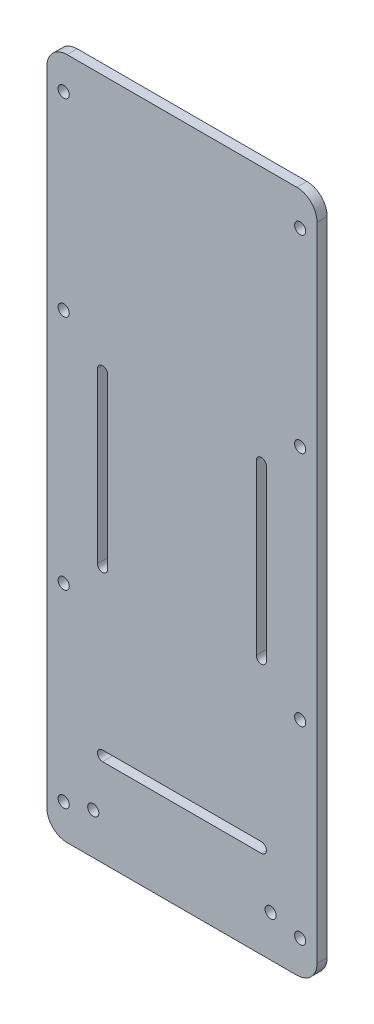
ISO-10303-21;
HEADER;
FILE_DESCRIPTION(('STEP AP214'),'2;1');
FILE_NAME('part.step','',(''),(''),'','','');
FILE_SCHEMA(('AUTOMOTIVE_DESIGN { 1 0 10303 214 1 1 1 1 }'));
ENDSEC;
DATA;
#1=APPLICATION_CONTEXT('core data for automotive mechanical design processes');
#2=APPLICATION_PROTOCOL_DEFINITION('international standard','automotive_design',2000,#1);
#3=PRODUCT_CONTEXT('',#1,'mechanical');
#4=PRODUCT('Part','Part','',(#3));
#5=PRODUCT_RELATED_PRODUCT_CATEGORY('part','',(#4));
#6=PRODUCT_DEFINITION_FORMATION('','',#4);
#7=PRODUCT_DEFINITION_CONTEXT('part definition',#1,'design');
#8=PRODUCT_DEFINITION('design','',#6,#7);
#9=PRODUCT_DEFINITION_SHAPE('','',#8);
#10=(LENGTH_UNIT() NAMED_UNIT(*) SI_UNIT(.MILLI.,.METRE.));
#11=(NAMED_UNIT(*) PLANE_ANGLE_UNIT() SI_UNIT($,.RADIAN.));
#12=(NAMED_UNIT(*) SI_UNIT($,.STERADIAN.) SOLID_ANGLE_UNIT());
#13=UNCERTAINTY_MEASURE_WITH_UNIT(LENGTH_MEASURE(1.E-05),#10,'distance_accuracy_value','');
#14=(GEOMETRIC_REPRESENTATION_CONTEXT(3) GLOBAL_UNCERTAINTY_ASSIGNED_CONTEXT((#13)) GLOBAL_UNIT_ASSIGNED_CONTEXT((#10,
#11,#12)) REPRESENTATION_CONTEXT('',''));
#15=CARTESIAN_POINT('',(0.,0.,0.));
#16=DIRECTION('',(0.,0.,1.));
#17=DIRECTION('',(1.,0.,0.));
#18=AXIS2_PLACEMENT_3D('',#15,#16,#17);
#19=CARTESIAN_POINT('',(-34.,-95.,3.));
#20=DIRECTION('',(0.,0.,1.));
#21=DIRECTION('',(1.,0.,0.));
#22=AXIS2_PLACEMENT_3D('',#19,#20,#21);
#23=PLANE('',#22);
#24=CARTESIAN_POINT('',(26.25,-88.75,3.));
#25=DIRECTION('',(0.,0.,1.));
#26=DIRECTION('',(1.,0.,0.));
#27=AXIS2_PLACEMENT_3D('',#24,#25,#26);
#28=CIRCLE('',#27,1.65);
#29=CARTESIAN_POINT('',(27.9,-88.75,3.));
#30=VERTEX_POINT('',#29);
#31=EDGE_CURVE('E223',#30,#30,#28,.T.);
#32=ORIENTED_EDGE('',*,*,#31,.F.);
#33=EDGE_LOOP('',(#32));
#34=FACE_BOUND('',#33,.T.);
#35=CARTESIAN_POINT('',(23.4999999999998,25.,3.));
#36=DIRECTION('',(0.,0.,1.));
#37=DIRECTION('',(-1.,0.,0.));
#38=AXIS2_PLACEMENT_3D('',#35,#36,#37);
#39=CIRCLE('',#38,1.5);
#40=CARTESIAN_POINT('',(24.9999999999998,25.,3.));
#41=VERTEX_POINT('',#40);
#42=CARTESIAN_POINT('',(21.9999999999998,25.,3.));
#43=VERTEX_POINT('',#42);
#44=EDGE_CURVE('E52',#41,#43,#39,.T.);
#45=ORIENTED_EDGE('',*,*,#44,.F.);
#46=DIRECTION('',(0.,1.,0.));
#47=VECTOR('',#46,1.);
#48=CARTESIAN_POINT('',(24.9999999999998,25.,3.));
#49=LINE('',#48,#47);
#50=CARTESIAN_POINT('',(25.0000000000002,-24.9999999999998,3.));
#51=VERTEX_POINT('',#50);
#52=EDGE_CURVE('E231',#51,#41,#49,.T.);
#53=ORIENTED_EDGE('',*,*,#52,.F.);
#54=CARTESIAN_POINT('',(23.5000000000002,-24.9999999999998,3.));
#55=DIRECTION('',(0.,0.,1.));
#56=DIRECTION('',(-1.,0.,0.));
#57=AXIS2_PLACEMENT_3D('',#54,#55,#56);
#58=CIRCLE('',#57,1.5);
#59=CARTESIAN_POINT('',(22.0000000000002,-24.9999999999998,3.));
#60=VERTEX_POINT('',#59);
#61=EDGE_CURVE('E245',#60,#51,#58,.T.);
#62=ORIENTED_EDGE('',*,*,#61,.F.);
#63=DIRECTION('',(0.,-1.,0.));
#64=VECTOR('',#63,1.);
#65=CARTESIAN_POINT('',(21.9999999999998,25.,3.));
#66=LINE('',#65,#64);
#67=EDGE_CURVE('E242',#43,#60,#66,.T.);
#68=ORIENTED_EDGE('',*,*,#67,.F.);
#69=EDGE_LOOP('',(#45,#53,#62,#68));
#70=FACE_BOUND('',#69,.T.);
#71=CARTESIAN_POINT('',(-23.4999999999998,-73.5,3.));
#72=DIRECTION('',(0.,0.,1.));
#73=DIRECTION('',(-1.,0.,0.));
#74=AXIS2_PLACEMENT_3D('',#71,#72,#73);
#75=CIRCLE('',#74,1.50000000000002);
#76=CARTESIAN_POINT('',(-23.4999999999998,-72.,3.));
#77=VERTEX_POINT('',#76);
#78=CARTESIAN_POINT('',(-23.4999999999998,-75.0000000000001,3.));
#79=VERTEX_POINT('',#78);
#80=EDGE_CURVE('E60',#77,#79,#75,.T.);
#81=ORIENTED_EDGE('',*,*,#80,.F.);
#82=DIRECTION('',(-1.,0.,0.));
#83=VECTOR('',#82,1.);
#84=CARTESIAN_POINT('',(-23.4999999999998,-72.,3.));
#85=LINE('',#84,#83);
#86=CARTESIAN_POINT('',(23.4999999999998,-72.,3.));
#87=VERTEX_POINT('',#86);
#88=EDGE_CURVE('E195',#87,#77,#85,.T.);
#89=ORIENTED_EDGE('',*,*,#88,.F.);
#90=CARTESIAN_POINT('',(23.4999999999998,-73.5,3.));
#91=DIRECTION('',(0.,0.,1.));
#92=DIRECTION('',(-1.,0.,0.));
#93=AXIS2_PLACEMENT_3D('',#90,#91,#92);
#94=CIRCLE('',#93,1.50000000000002);
#95=CARTESIAN_POINT('',(23.4999999999998,-75.0000000000001,3.));
#96=VERTEX_POINT('',#95);
#97=EDGE_CURVE('E198',#96,#87,#94,.T.);
#98=ORIENTED_EDGE('',*,*,#97,.F.);
#99=DIRECTION('',(1.,0.,0.));
#100=VECTOR('',#99,1.);
#101=CARTESIAN_POINT('',(-23.4999999999998,-75.0000000000001,3.));
#102=LINE('',#101,#100);
#103=EDGE_CURVE('E204',#79,#96,#102,.T.);
#104=ORIENTED_EDGE('',*,*,#103,.F.);
#105=EDGE_LOOP('',(#81,#89,#98,#104));
#106=FACE_BOUND('',#105,.T.);
#107=CARTESIAN_POINT('',(-26.25,-88.75,3.));
#108=DIRECTION('',(0.,0.,1.));
#109=DIRECTION('',(1.,0.,0.));
#110=AXIS2_PLACEMENT_3D('',#107,#108,#109);
#111=CIRCLE('',#110,1.65);
#112=CARTESIAN_POINT('',(-24.6,-88.75,3.));
#113=VERTEX_POINT('',#112);
#114=EDGE_CURVE('E216',#113,#113,#111,.T.);
#115=ORIENTED_EDGE('',*,*,#114,.F.);
#116=EDGE_LOOP('',(#115));
#117=FACE_BOUND('',#116,.T.);
#118=CARTESIAN_POINT('',(-23.5,25.,3.));
#119=DIRECTION('',(0.,0.,1.));
#120=DIRECTION('',(1.,0.,0.));
#121=AXIS2_PLACEMENT_3D('',#118,#119,#120);
#122=CIRCLE('',#121,1.5);
#123=CARTESIAN_POINT('',(-22.,25.,3.));
#124=VERTEX_POINT('',#123);
#125=CARTESIAN_POINT('',(-25.,25.,3.));
#126=VERTEX_POINT('',#125);
#127=EDGE_CURVE('E222',#124,#126,#122,.T.);
#128=ORIENTED_EDGE('',*,*,#127,.F.);
#129=DIRECTION('',(0.,1.,0.));
#130=VECTOR('',#129,1.);
#131=CARTESIAN_POINT('',(-22.,25.,3.));
#132=LINE('',#131,#130);
#133=CARTESIAN_POINT('',(-22.,-25.,3.));
#134=VERTEX_POINT('',#133);
#135=EDGE_CURVE('E260',#134,#124,#132,.T.);
#136=ORIENTED_EDGE('',*,*,#135,.F.);
#137=CARTESIAN_POINT('',(-23.5,-25.,3.));
#138=DIRECTION('',(0.,0.,1.));
#139=DIRECTION('',(1.,0.,0.));
#140=AXIS2_PLACEMENT_3D('',#137,#138,#139);
#141=CIRCLE('',#140,1.5);
#142=CARTESIAN_POINT('',(-25.,-25.,3.));
#143=VERTEX_POINT('',#142);
#144=EDGE_CURVE('E274',#143,#134,#141,.T.);
#145=ORIENTED_EDGE('',*,*,#144,.F.);
#146=DIRECTION('',(0.,-1.,0.));
#147=VECTOR('',#146,1.);
#148=CARTESIAN_POINT('',(-25.,25.,3.));
#149=LINE('',#148,#147);
#150=EDGE_CURVE('E271',#126,#143,#149,.T.);
#151=ORIENTED_EDGE('',*,*,#150,.F.);
#152=EDGE_LOOP('',(#128,#136,#145,#151));
#153=FACE_BOUND('',#152,.T.);
#154=CARTESIAN_POINT('',(-35.,-35.,3.));
#155=DIRECTION('',(0.,0.,1.));
#156=DIRECTION('',(-1.,0.,0.));
#157=AXIS2_PLACEMENT_3D('',#154,#155,#156);
#158=CIRCLE('',#157,1.65);
#159=CARTESIAN_POINT('',(-36.65,-35.,3.));
#160=VERTEX_POINT('',#159);
#161=EDGE_CURVE('E294',#160,#160,#158,.T.);
#162=ORIENTED_EDGE('',*,*,#161,.F.);
#163=EDGE_LOOP('',(#162));
#164=FACE_BOUND('',#163,.T.);
#165=CARTESIAN_POINT('',(34.9999999999994,-91.0000000000002,3.));
#166=DIRECTION('',(0.,0.,1.));
#167=DIRECTION('',(1.,0.,0.));
#168=AXIS2_PLACEMENT_3D('',#165,#166,#167);
#169=CIRCLE('',#168,1.65);
#170=CARTESIAN_POINT('',(36.6499999999994,-91.0000000000002,3.));
#171=VERTEX_POINT('',#170);
#172=EDGE_CURVE('E306',#171,#171,#169,.T.);
#173=ORIENTED_EDGE('',*,*,#172,.F.);
#174=EDGE_LOOP('',(#173));
#175=FACE_BOUND('',#174,.T.);
#176=CARTESIAN_POINT('',(34.9999999999998,35.0000000000002,3.));
#177=DIRECTION('',(0.,0.,1.));
#178=DIRECTION('',(-1.,0.,0.));
#179=AXIS2_PLACEMENT_3D('',#176,#177,#178);
#180=CIRCLE('',#179,1.65);
#181=CARTESIAN_POINT('',(33.3499999999998,35.0000000000002,3.));
#182=VERTEX_POINT('',#181);
#183=EDGE_CURVE('E318',#182,#182,#180,.T.);
#184=ORIENTED_EDGE('',*,*,#183,.F.);
#185=EDGE_LOOP('',(#184));
#186=FACE_BOUND('',#185,.T.);
#187=CARTESIAN_POINT('',(-35.,91.,3.));
#188=DIRECTION('',(0.,0.,1.));
#189=DIRECTION('',(1.,0.,0.));
#190=AXIS2_PLACEMENT_3D('',#187,#188,#189);
#191=CIRCLE('',#190,1.65);
#192=CARTESIAN_POINT('',(-33.35,91.,3.));
#193=VERTEX_POINT('',#192);
#194=EDGE_CURVE('E330',#193,#193,#191,.T.);
#195=ORIENTED_EDGE('',*,*,#194,.F.);
#196=EDGE_LOOP('',(#195));
#197=FACE_BOUND('',#196,.T.);
#198=CARTESIAN_POINT('',(-34.,-95.,3.));
#199=DIRECTION('',(0.,0.,1.));
#200=DIRECTION('',(1.,0.,0.));
#201=AXIS2_PLACEMENT_3D('',#198,#199,#200);
#202=CIRCLE('',#201,6.);
#203=CARTESIAN_POINT('',(-40.,-94.9999999999999,3.));
#204=VERTEX_POINT('',#203);
#205=CARTESIAN_POINT('',(-34.,-101.,3.));
#206=VERTEX_POINT('',#205);
#207=EDGE_CURVE('E336',#204,#206,#202,.T.);
#208=ORIENTED_EDGE('',*,*,#207,.T.);
#209=DIRECTION('',(1.,0.,0.));
#210=VECTOR('',#209,1.);
#211=CARTESIAN_POINT('',(-34.,-101.,3.));
#212=LINE('',#211,#210);
#213=CARTESIAN_POINT('',(34.,-101.,3.));
#214=VERTEX_POINT('',#213);
#215=EDGE_CURVE('E339',#206,#214,#212,.T.);
#216=ORIENTED_EDGE('',*,*,#215,.T.);
#217=CARTESIAN_POINT('',(34.,-95.,3.));
#218=DIRECTION('',(0.,0.,1.));
#219=DIRECTION('',(1.,0.,0.));
#220=AXIS2_PLACEMENT_3D('',#217,#218,#219);
#221=CIRCLE('',#220,6.);
#222=CARTESIAN_POINT('',(40.,-94.9999999999999,3.));
#223=VERTEX_POINT('',#222);
#224=EDGE_CURVE('E342',#214,#223,#221,.T.);
#225=ORIENTED_EDGE('',*,*,#224,.T.);
#226=DIRECTION('',(0.,1.,0.));
#227=VECTOR('',#226,1.);
#228=CARTESIAN_POINT('',(40.,95.,3.));
#229=LINE('',#228,#227);
#230=CARTESIAN_POINT('',(40.,95.,3.));
#231=VERTEX_POINT('',#230);
#232=EDGE_CURVE('E344',#223,#231,#229,.T.);
#233=ORIENTED_EDGE('',*,*,#232,.T.);
#234=CARTESIAN_POINT('',(34.,95.,3.));
#235=DIRECTION('',(0.,0.,1.));
#236=DIRECTION('',(-1.,0.,0.));
#237=AXIS2_PLACEMENT_3D('',#234,#235,#236);
#238=CIRCLE('',#237,6.);
#239=CARTESIAN_POINT('',(34.,101.,3.));
#240=VERTEX_POINT('',#239);
#241=EDGE_CURVE('E346',#231,#240,#238,.T.);
#242=ORIENTED_EDGE('',*,*,#241,.T.);
#243=DIRECTION('',(-1.,0.,0.));
#244=VECTOR('',#243,1.);
#245=CARTESIAN_POINT('',(-34.,101.,3.));
#246=LINE('',#245,#244);
#247=CARTESIAN_POINT('',(-34.,101.,3.));
#248=VERTEX_POINT('',#247);
#249=EDGE_CURVE('E348',#240,#248,#246,.T.);
#250=ORIENTED_EDGE('',*,*,#249,.T.);
#251=CARTESIAN_POINT('',(-34.,95.,3.));
#252=DIRECTION('',(0.,0.,1.));
#253=DIRECTION('',(-1.,0.,0.));
#254=AXIS2_PLACEMENT_3D('',#251,#252,#253);
#255=CIRCLE('',#254,6.);
#256=CARTESIAN_POINT('',(-40.,95.,3.));
#257=VERTEX_POINT('',#256);
#258=EDGE_CURVE('E350',#248,#257,#255,.T.);
#259=ORIENTED_EDGE('',*,*,#258,.T.);
#260=DIRECTION('',(0.,-1.,0.));
#261=VECTOR('',#260,1.);
#262=CARTESIAN_POINT('',(-40.,95.,3.));
#263=LINE('',#262,#261);
#264=EDGE_CURVE('E352',#257,#204,#263,.T.);
#265=ORIENTED_EDGE('',*,*,#264,.T.);
#266=EDGE_LOOP('',(#208,#216,#225,#233,#242,#250,#259,#265));
#267=FACE_BOUND('',#266,.T.);
#268=CARTESIAN_POINT('',(-35.,35.,3.));
#269=DIRECTION('',(0.,0.,1.));
#270=DIRECTION('',(1.,0.,0.));
#271=AXIS2_PLACEMENT_3D('',#268,#269,#270);
#272=CIRCLE('',#271,1.65);
#273=CARTESIAN_POINT('',(-33.35,35.,3.));
#274=VERTEX_POINT('',#273);
#275=EDGE_CURVE('E324',#274,#274,#272,.T.);
#276=ORIENTED_EDGE('',*,*,#275,.F.);
#277=EDGE_LOOP('',(#276));
#278=FACE_BOUND('',#277,.T.);
#279=CARTESIAN_POINT('',(34.9999999999994,91.0000000000002,3.));
#280=DIRECTION('',(0.,0.,1.));
#281=DIRECTION('',(-1.,0.,0.));
#282=AXIS2_PLACEMENT_3D('',#279,#280,#281);
#283=CIRCLE('',#282,1.65);
#284=CARTESIAN_POINT('',(33.3499999999994,91.0000000000002,3.));
#285=VERTEX_POINT('',#284);
#286=EDGE_CURVE('E312',#285,#285,#283,.T.);
#287=ORIENTED_EDGE('',*,*,#286,.F.);
#288=EDGE_LOOP('',(#287));
#289=FACE_BOUND('',#288,.T.);
#290=CARTESIAN_POINT('',(-35.,-91.,3.));
#291=DIRECTION('',(0.,0.,1.));
#292=DIRECTION('',(-1.,0.,0.));
#293=AXIS2_PLACEMENT_3D('',#290,#291,#292);
#294=CIRCLE('',#293,1.65);
#295=CARTESIAN_POINT('',(-36.65,-91.,3.));
#296=VERTEX_POINT('',#295);
#297=EDGE_CURVE('E300',#296,#296,#294,.T.);
#298=ORIENTED_EDGE('',*,*,#297,.F.);
#299=EDGE_LOOP('',(#298));
#300=FACE_BOUND('',#299,.T.);
#301=CARTESIAN_POINT('',(34.9999999999998,-35.0000000000002,3.));
#302=DIRECTION('',(0.,0.,1.));
#303=DIRECTION('',(1.,0.,0.));
#304=AXIS2_PLACEMENT_3D('',#301,#302,#303);
#305=CIRCLE('',#304,1.65);
#306=CARTESIAN_POINT('',(36.6499999999998,-35.0000000000002,3.));
#307=VERTEX_POINT('',#306);
#308=EDGE_CURVE('E288',#307,#307,#305,.T.);
#309=ORIENTED_EDGE('',*,*,#308,.F.);
#310=EDGE_LOOP('',(#309));
#311=FACE_BOUND('',#310,.T.);
#312=ADVANCED_FACE('F37',(#34,#70,#106,#117,#153,#164,#175,#186,#197,#267,#278,#289,#300,#311),
#23,.T.);
#313=CARTESIAN_POINT('',(-34.,-95.,0.));
#314=DIRECTION('',(0.,0.,1.));
#315=DIRECTION('',(1.,0.,0.));
#316=AXIS2_PLACEMENT_3D('',#313,#314,#315);
#317=PLANE('',#316);
#318=CARTESIAN_POINT('',(26.25,-88.75,0.));
#319=DIRECTION('',(0.,0.,1.));
#320=DIRECTION('',(1.,0.,0.));
#321=AXIS2_PLACEMENT_3D('',#318,#319,#320);
#322=CIRCLE('',#321,1.65);
#323=CARTESIAN_POINT('',(27.9,-88.75,0.));
#324=VERTEX_POINT('',#323);
#325=EDGE_CURVE('E219',#324,#324,#322,.T.);
#326=ORIENTED_EDGE('',*,*,#325,.T.);
#327=EDGE_LOOP('',(#326));
#328=FACE_BOUND('',#327,.T.);
#329=DIRECTION('',(0.,1.,0.));
#330=VECTOR('',#329,1.);
#331=CARTESIAN_POINT('',(24.9999999999998,25.,0.));
#332=LINE('',#331,#330);
#333=CARTESIAN_POINT('',(25.0000000000002,-24.9999999999998,0.));
#334=VERTEX_POINT('',#333);
#335=CARTESIAN_POINT('',(24.9999999999998,25.,0.));
#336=VERTEX_POINT('',#335);
#337=EDGE_CURVE('E237',#334,#336,#332,.T.);
#338=ORIENTED_EDGE('',*,*,#337,.T.);
#339=CARTESIAN_POINT('',(23.4999999999998,25.,0.));
#340=DIRECTION('',(0.,0.,1.));
#341=DIRECTION('',(-1.,0.,0.));
#342=AXIS2_PLACEMENT_3D('',#339,#340,#341);
#343=CIRCLE('',#342,1.5);
#344=CARTESIAN_POINT('',(21.9999999999998,25.,0.));
#345=VERTEX_POINT('',#344);
#346=EDGE_CURVE('E227',#336,#345,#343,.T.);
#347=ORIENTED_EDGE('',*,*,#346,.T.);
#348=DIRECTION('',(0.,-1.,0.));
#349=VECTOR('',#348,1.);
#350=CARTESIAN_POINT('',(21.9999999999998,25.,0.));
#351=LINE('',#350,#349);
#352=CARTESIAN_POINT('',(22.0000000000002,-24.9999999999998,0.));
#353=VERTEX_POINT('',#352);
#354=EDGE_CURVE('E230',#345,#353,#351,.T.);
#355=ORIENTED_EDGE('',*,*,#354,.T.);
#356=CARTESIAN_POINT('',(23.5000000000002,-24.9999999999998,0.));
#357=DIRECTION('',(0.,0.,1.));
#358=DIRECTION('',(-1.,0.,0.));
#359=AXIS2_PLACEMENT_3D('',#356,#357,#358);
#360=CIRCLE('',#359,1.5);
#361=EDGE_CURVE('E234',#353,#334,#360,.T.);
#362=ORIENTED_EDGE('',*,*,#361,.T.);
#363=EDGE_LOOP('',(#338,#347,#355,#362));
#364=FACE_BOUND('',#363,.T.);
#365=DIRECTION('',(-1.,0.,0.));
#366=VECTOR('',#365,1.);
#367=CARTESIAN_POINT('',(-23.4999999999998,-72.,0.));
#368=LINE('',#367,#366);
#369=CARTESIAN_POINT('',(23.4999999999998,-72.,0.));
#370=VERTEX_POINT('',#369);
#371=CARTESIAN_POINT('',(-23.4999999999998,-72.,0.));
#372=VERTEX_POINT('',#371);
#373=EDGE_CURVE('E182',#370,#372,#368,.T.);
#374=ORIENTED_EDGE('',*,*,#373,.T.);
#375=CARTESIAN_POINT('',(-23.4999999999998,-73.5,0.));
#376=DIRECTION('',(0.,0.,1.));
#377=DIRECTION('',(-1.,0.,0.));
#378=AXIS2_PLACEMENT_3D('',#375,#376,#377);
#379=CIRCLE('',#378,1.50000000000002);
#380=CARTESIAN_POINT('',(-23.4999999999998,-75.0000000000001,0.));
#381=VERTEX_POINT('',#380);
#382=EDGE_CURVE('E176',#372,#381,#379,.T.);
#383=ORIENTED_EDGE('',*,*,#382,.T.);
#384=DIRECTION('',(1.,0.,0.));
#385=VECTOR('',#384,1.);
#386=CARTESIAN_POINT('',(-23.4999999999998,-75.0000000000001,0.));
#387=LINE('',#386,#385);
#388=CARTESIAN_POINT('',(23.4999999999998,-75.0000000000001,0.));
#389=VERTEX_POINT('',#388);
#390=EDGE_CURVE('E186',#381,#389,#387,.T.);
#391=ORIENTED_EDGE('',*,*,#390,.T.);
#392=CARTESIAN_POINT('',(23.4999999999998,-73.5,0.));
#393=DIRECTION('',(0.,0.,1.));
#394=DIRECTION('',(-1.,0.,0.));
#395=AXIS2_PLACEMENT_3D('',#392,#393,#394);
#396=CIRCLE('',#395,1.50000000000002);
#397=EDGE_CURVE('E190',#389,#370,#396,.T.);
#398=ORIENTED_EDGE('',*,*,#397,.T.);
#399=EDGE_LOOP('',(#374,#383,#391,#398));
#400=FACE_BOUND('',#399,.T.);
#401=CARTESIAN_POINT('',(-26.25,-88.75,0.));
#402=DIRECTION('',(0.,0.,1.));
#403=DIRECTION('',(1.,0.,0.));
#404=AXIS2_PLACEMENT_3D('',#401,#402,#403);
#405=CIRCLE('',#404,1.65);
#406=CARTESIAN_POINT('',(-24.6,-88.75,0.));
#407=VERTEX_POINT('',#406);
#408=EDGE_CURVE('E205',#407,#407,#405,.T.);
#409=ORIENTED_EDGE('',*,*,#408,.T.);
#410=EDGE_LOOP('',(#409));
#411=FACE_BOUND('',#410,.T.);
#412=DIRECTION('',(0.,1.,0.));
#413=VECTOR('',#412,1.);
#414=CARTESIAN_POINT('',(-22.,25.,0.));
#415=LINE('',#414,#413);
#416=CARTESIAN_POINT('',(-22.,-25.,0.));
#417=VERTEX_POINT('',#416);
#418=CARTESIAN_POINT('',(-22.,25.,0.));
#419=VERTEX_POINT('',#418);
#420=EDGE_CURVE('E266',#417,#419,#415,.T.);
#421=ORIENTED_EDGE('',*,*,#420,.T.);
#422=CARTESIAN_POINT('',(-23.5,25.,0.));
#423=DIRECTION('',(0.,0.,1.));
#424=DIRECTION('',(1.,0.,0.));
#425=AXIS2_PLACEMENT_3D('',#422,#423,#424);
#426=CIRCLE('',#425,1.5);
#427=CARTESIAN_POINT('',(-25.,25.,0.));
#428=VERTEX_POINT('',#427);
#429=EDGE_CURVE('E256',#419,#428,#426,.T.);
#430=ORIENTED_EDGE('',*,*,#429,.T.);
#431=DIRECTION('',(0.,-1.,0.));
#432=VECTOR('',#431,1.);
#433=CARTESIAN_POINT('',(-25.,25.,0.));
#434=LINE('',#433,#432);
#435=CARTESIAN_POINT('',(-25.,-25.,0.));
#436=VERTEX_POINT('',#435);
#437=EDGE_CURVE('E259',#428,#436,#434,.T.);
#438=ORIENTED_EDGE('',*,*,#437,.T.);
#439=CARTESIAN_POINT('',(-23.5,-25.,0.));
#440=DIRECTION('',(0.,0.,1.));
#441=DIRECTION('',(1.,0.,0.));
#442=AXIS2_PLACEMENT_3D('',#439,#440,#441);
#443=CIRCLE('',#442,1.5);
#444=EDGE_CURVE('E263',#436,#417,#443,.T.);
#445=ORIENTED_EDGE('',*,*,#444,.T.);
#446=EDGE_LOOP('',(#421,#430,#438,#445));
#447=FACE_BOUND('',#446,.T.);
#448=CARTESIAN_POINT('',(-34.,-95.,0.));
#449=DIRECTION('',(0.,0.,1.));
#450=DIRECTION('',(1.,0.,0.));
#451=AXIS2_PLACEMENT_3D('',#448,#449,#450);
#452=CIRCLE('',#451,6.);
#453=CARTESIAN_POINT('',(-40.,-94.9999999999999,0.));
#454=VERTEX_POINT('',#453);
#455=CARTESIAN_POINT('',(-34.,-101.,0.));
#456=VERTEX_POINT('',#455);
#457=EDGE_CURVE('E333',#454,#456,#452,.T.);
#458=ORIENTED_EDGE('',*,*,#457,.F.);
#459=DIRECTION('',(0.,-1.,0.));
#460=VECTOR('',#459,1.);
#461=CARTESIAN_POINT('',(-40.,95.,0.));
#462=LINE('',#461,#460);
#463=CARTESIAN_POINT('',(-40.,95.,0.));
#464=VERTEX_POINT('',#463);
#465=EDGE_CURVE('E340',#464,#454,#462,.T.);
#466=ORIENTED_EDGE('',*,*,#465,.F.);
#467=CARTESIAN_POINT('',(-34.,95.,0.));
#468=DIRECTION('',(0.,0.,1.));
#469=DIRECTION('',(-1.,0.,0.));
#470=AXIS2_PLACEMENT_3D('',#467,#468,#469);
#471=CIRCLE('',#470,6.);
#472=CARTESIAN_POINT('',(-34.,101.,0.));
#473=VERTEX_POINT('',#472);
#474=EDGE_CURVE('E367',#473,#464,#471,.T.);
#475=ORIENTED_EDGE('',*,*,#474,.F.);
#476=DIRECTION('',(-1.,0.,0.));
#477=VECTOR('',#476,1.);
#478=CARTESIAN_POINT('',(-34.,101.,0.));
#479=LINE('',#478,#477);
#480=CARTESIAN_POINT('',(34.,101.,0.));
#481=VERTEX_POINT('',#480);
#482=EDGE_CURVE('E365',#481,#473,#479,.T.);
#483=ORIENTED_EDGE('',*,*,#482,.F.);
#484=CARTESIAN_POINT('',(34.,95.,0.));
#485=DIRECTION('',(0.,0.,1.));
#486=DIRECTION('',(-1.,0.,0.));
#487=AXIS2_PLACEMENT_3D('',#484,#485,#486);
#488=CIRCLE('',#487,6.);
#489=CARTESIAN_POINT('',(40.,95.,0.));
#490=VERTEX_POINT('',#489);
#491=EDGE_CURVE('E363',#490,#481,#488,.T.);
#492=ORIENTED_EDGE('',*,*,#491,.F.);
#493=DIRECTION('',(0.,1.,0.));
#494=VECTOR('',#493,1.);
#495=CARTESIAN_POINT('',(40.,95.,0.));
#496=LINE('',#495,#494);
#497=CARTESIAN_POINT('',(40.,-94.9999999999999,0.));
#498=VERTEX_POINT('',#497);
#499=EDGE_CURVE('E361',#498,#490,#496,.T.);
#500=ORIENTED_EDGE('',*,*,#499,.F.);
#501=CARTESIAN_POINT('',(34.,-95.,0.));
#502=DIRECTION('',(0.,0.,1.));
#503=DIRECTION('',(1.,0.,0.));
#504=AXIS2_PLACEMENT_3D('',#501,#502,#503);
#505=CIRCLE('',#504,6.);
#506=CARTESIAN_POINT('',(34.,-101.,0.));
#507=VERTEX_POINT('',#506);
#508=EDGE_CURVE('E359',#507,#498,#505,.T.);
#509=ORIENTED_EDGE('',*,*,#508,.F.);
#510=DIRECTION('',(1.,0.,0.));
#511=VECTOR('',#510,1.);
#512=CARTESIAN_POINT('',(-34.,-101.,0.));
#513=LINE('',#512,#511);
#514=EDGE_CURVE('E357',#456,#507,#513,.T.);
#515=ORIENTED_EDGE('',*,*,#514,.F.);
#516=EDGE_LOOP('',(#458,#466,#475,#483,#492,#500,#509,#515));
#517=FACE_BOUND('',#516,.T.);
#518=CARTESIAN_POINT('',(-35.,91.,0.));
#519=DIRECTION('',(0.,0.,1.));
#520=DIRECTION('',(1.,0.,0.));
#521=AXIS2_PLACEMENT_3D('',#518,#519,#520);
#522=CIRCLE('',#521,1.65);
#523=CARTESIAN_POINT('',(-33.35,91.,0.));
#524=VERTEX_POINT('',#523);
#525=EDGE_CURVE('E327',#524,#524,#522,.T.);
#526=ORIENTED_EDGE('',*,*,#525,.T.);
#527=EDGE_LOOP('',(#526));
#528=FACE_BOUND('',#527,.T.);
#529=CARTESIAN_POINT('',(-35.,35.,0.));
#530=DIRECTION('',(0.,0.,1.));
#531=DIRECTION('',(1.,0.,0.));
#532=AXIS2_PLACEMENT_3D('',#529,#530,#531);
#533=CIRCLE('',#532,1.65);
#534=CARTESIAN_POINT('',(-33.35,35.,0.));
#535=VERTEX_POINT('',#534);
#536=EDGE_CURVE('E321',#535,#535,#533,.T.);
#537=ORIENTED_EDGE('',*,*,#536,.T.);
#538=EDGE_LOOP('',(#537));
#539=FACE_BOUND('',#538,.T.);
#540=CARTESIAN_POINT('',(34.9999999999998,35.0000000000002,0.));
#541=DIRECTION('',(0.,0.,1.));
#542=DIRECTION('',(-1.,0.,0.));
#543=AXIS2_PLACEMENT_3D('',#540,#541,#542);
#544=CIRCLE('',#543,1.65);
#545=CARTESIAN_POINT('',(33.3499999999998,35.0000000000002,0.));
#546=VERTEX_POINT('',#545);
#547=EDGE_CURVE('E315',#546,#546,#544,.T.);
#548=ORIENTED_EDGE('',*,*,#547,.T.);
#549=EDGE_LOOP('',(#548));
#550=FACE_BOUND('',#549,.T.);
#551=CARTESIAN_POINT('',(34.9999999999994,91.0000000000002,0.));
#552=DIRECTION('',(0.,0.,1.));
#553=DIRECTION('',(-1.,0.,0.));
#554=AXIS2_PLACEMENT_3D('',#551,#552,#553);
#555=CIRCLE('',#554,1.65);
#556=CARTESIAN_POINT('',(33.3499999999994,91.0000000000002,0.));
#557=VERTEX_POINT('',#556);
#558=EDGE_CURVE('E309',#557,#557,#555,.T.);
#559=ORIENTED_EDGE('',*,*,#558,.T.);
#560=EDGE_LOOP('',(#559));
#561=FACE_BOUND('',#560,.T.);
#562=CARTESIAN_POINT('',(34.9999999999994,-91.0000000000002,0.));
#563=DIRECTION('',(0.,0.,1.));
#564=DIRECTION('',(1.,0.,0.));
#565=AXIS2_PLACEMENT_3D('',#562,#563,#564);
#566=CIRCLE('',#565,1.65);
#567=CARTESIAN_POINT('',(36.6499999999994,-91.0000000000002,0.));
#568=VERTEX_POINT('',#567);
#569=EDGE_CURVE('E303',#568,#568,#566,.T.);
#570=ORIENTED_EDGE('',*,*,#569,.T.);
#571=EDGE_LOOP('',(#570));
#572=FACE_BOUND('',#571,.T.);
#573=CARTESIAN_POINT('',(-35.,-91.,0.));
#574=DIRECTION('',(0.,0.,1.));
#575=DIRECTION('',(-1.,0.,0.));
#576=AXIS2_PLACEMENT_3D('',#573,#574,#575);
#577=CIRCLE('',#576,1.65);
#578=CARTESIAN_POINT('',(-36.65,-91.,0.));
#579=VERTEX_POINT('',#578);
#580=EDGE_CURVE('E297',#579,#579,#577,.T.);
#581=ORIENTED_EDGE('',*,*,#580,.T.);
#582=EDGE_LOOP('',(#581));
#583=FACE_BOUND('',#582,.T.);
#584=CARTESIAN_POINT('',(-35.,-35.,0.));
#585=DIRECTION('',(0.,0.,1.));
#586=DIRECTION('',(-1.,0.,0.));
#587=AXIS2_PLACEMENT_3D('',#584,#585,#586);
#588=CIRCLE('',#587,1.65);
#589=CARTESIAN_POINT('',(-36.65,-35.,0.));
#590=VERTEX_POINT('',#589);
#591=EDGE_CURVE('E291',#590,#590,#588,.T.);
#592=ORIENTED_EDGE('',*,*,#591,.T.);
#593=EDGE_LOOP('',(#592));
#594=FACE_BOUND('',#593,.T.);
#595=CARTESIAN_POINT('',(34.9999999999998,-35.0000000000002,0.));
#596=DIRECTION('',(0.,0.,1.));
#597=DIRECTION('',(1.,0.,0.));
#598=AXIS2_PLACEMENT_3D('',#595,#596,#597);
#599=CIRCLE('',#598,1.65);
#600=CARTESIAN_POINT('',(36.6499999999998,-35.0000000000002,0.));
#601=VERTEX_POINT('',#600);
#602=EDGE_CURVE('E281',#601,#601,#599,.T.);
#603=ORIENTED_EDGE('',*,*,#602,.T.);
#604=EDGE_LOOP('',(#603));
#605=FACE_BOUND('',#604,.T.);
#606=ADVANCED_FACE('F192',(#328,#364,#400,#411,#447,#517,#528,#539,#550,#561,#572,#583,#594,
#605),#317,.F.);
#607=CARTESIAN_POINT('',(-34.,-95.,3.));
#608=DIRECTION('',(0.,0.,-1.));
#609=DIRECTION('',(-1.,0.,0.));
#610=AXIS2_PLACEMENT_3D('',#607,#608,#609);
#611=CYLINDRICAL_SURFACE('',#610,6.);
#612=ORIENTED_EDGE('',*,*,#457,.T.);
#613=DIRECTION('',(0.,0.,-1.));
#614=VECTOR('',#613,1.);
#615=CARTESIAN_POINT('',(-34.,-101.,3.));
#616=LINE('',#615,#614);
#617=EDGE_CURVE('E11',#206,#456,#616,.T.);
#618=ORIENTED_EDGE('',*,*,#617,.F.);
#619=ORIENTED_EDGE('',*,*,#207,.F.);
#620=DIRECTION('',(0.,0.,-1.));
#621=VECTOR('',#620,1.);
#622=CARTESIAN_POINT('',(-40.,-94.9999999999999,3.));
#623=LINE('',#622,#621);
#624=EDGE_CURVE('E354',#204,#454,#623,.T.);
#625=ORIENTED_EDGE('',*,*,#624,.T.);
#626=EDGE_LOOP('',(#612,#618,#619,#625));
#627=FACE_BOUND('',#626,.T.);
#628=ADVANCED_FACE('F39',(#627),#611,.T.);
#629=CARTESIAN_POINT('',(-34.,-101.,3.));
#630=DIRECTION('',(0.,1.,0.));
#631=DIRECTION('',(0.,0.,1.));
#632=AXIS2_PLACEMENT_3D('',#629,#630,#631);
#633=PLANE('',#632);
#634=ORIENTED_EDGE('',*,*,#514,.T.);
#635=DIRECTION('',(0.,0.,-1.));
#636=VECTOR('',#635,1.);
#637=CARTESIAN_POINT('',(34.,-101.,3.));
#638=LINE('',#637,#636);
#639=EDGE_CURVE('E45',#214,#507,#638,.T.);
#640=ORIENTED_EDGE('',*,*,#639,.F.);
#641=ORIENTED_EDGE('',*,*,#215,.F.);
#642=ORIENTED_EDGE('',*,*,#617,.T.);
#643=EDGE_LOOP('',(#634,#640,#641,#642));
#644=FACE_BOUND('',#643,.T.);
#645=ADVANCED_FACE('F414',(#644),#633,.F.);
#646=CARTESIAN_POINT('',(34.,-95.,3.));
#647=DIRECTION('',(0.,0.,-1.));
#648=DIRECTION('',(-1.,0.,0.));
#649=AXIS2_PLACEMENT_3D('',#646,#647,#648);
#650=CYLINDRICAL_SURFACE('',#649,6.);
#651=ORIENTED_EDGE('',*,*,#508,.T.);
#652=DIRECTION('',(0.,0.,-1.));
#653=VECTOR('',#652,1.);
#654=CARTESIAN_POINT('',(40.,-94.9999999999999,3.));
#655=LINE('',#654,#653);
#656=EDGE_CURVE('E384',#223,#498,#655,.T.);
#657=ORIENTED_EDGE('',*,*,#656,.F.);
#658=ORIENTED_EDGE('',*,*,#224,.F.);
#659=ORIENTED_EDGE('',*,*,#639,.T.);
#660=EDGE_LOOP('',(#651,#657,#658,#659));
#661=FACE_BOUND('',#660,.T.);
#662=ADVANCED_FACE('F391',(#661),#650,.T.);
#663=CARTESIAN_POINT('',(40.,95.,3.));
#664=DIRECTION('',(-1.,0.,0.));
#665=DIRECTION('',(0.,-1.,0.));
#666=AXIS2_PLACEMENT_3D('',#663,#664,#665);
#667=PLANE('',#666);
#668=ORIENTED_EDGE('',*,*,#499,.T.);
#669=DIRECTION('',(0.,0.,-1.));
#670=VECTOR('',#669,1.);
#671=CARTESIAN_POINT('',(40.,95.,3.));
#672=LINE('',#671,#670);
#673=EDGE_CURVE('E381',#231,#490,#672,.T.);
#674=ORIENTED_EDGE('',*,*,#673,.F.);
#675=ORIENTED_EDGE('',*,*,#232,.F.);
#676=ORIENTED_EDGE('',*,*,#656,.T.);
#677=EDGE_LOOP('',(#668,#674,#675,#676));
#678=FACE_BOUND('',#677,.T.);
#679=ADVANCED_FACE('F402',(#678),#667,.F.);
#680=CARTESIAN_POINT('',(34.,95.,3.));
#681=DIRECTION('',(0.,0.,-1.));
#682=DIRECTION('',(-1.,0.,0.));
#683=AXIS2_PLACEMENT_3D('',#680,#681,#682);
#684=CYLINDRICAL_SURFACE('',#683,6.);
#685=ORIENTED_EDGE('',*,*,#491,.T.);
#686=DIRECTION('',(0.,0.,-1.));
#687=VECTOR('',#686,1.);
#688=CARTESIAN_POINT('',(34.,101.,3.));
#689=LINE('',#688,#687);
#690=EDGE_CURVE('E378',#240,#481,#689,.T.);
#691=ORIENTED_EDGE('',*,*,#690,.F.);
#692=ORIENTED_EDGE('',*,*,#241,.F.);
#693=ORIENTED_EDGE('',*,*,#673,.T.);
#694=EDGE_LOOP('',(#685,#691,#692,#693));
#695=FACE_BOUND('',#694,.T.);
#696=ADVANCED_FACE('F406',(#695),#684,.T.);
#697=CARTESIAN_POINT('',(-34.,101.,3.));
#698=DIRECTION('',(0.,-1.,0.));
#699=DIRECTION('',(0.,0.,-1.));
#700=AXIS2_PLACEMENT_3D('',#697,#698,#699);
#701=PLANE('',#700);
#702=ORIENTED_EDGE('',*,*,#482,.T.);
#703=DIRECTION('',(0.,0.,-1.));
#704=VECTOR('',#703,1.);
#705=CARTESIAN_POINT('',(-34.,101.,3.));
#706=LINE('',#705,#704);
#707=EDGE_CURVE('E375',#248,#473,#706,.T.);
#708=ORIENTED_EDGE('',*,*,#707,.F.);
#709=ORIENTED_EDGE('',*,*,#249,.F.);
#710=ORIENTED_EDGE('',*,*,#690,.T.);
#711=EDGE_LOOP('',(#702,#708,#709,#710));
#712=FACE_BOUND('',#711,.T.);
#713=ADVANCED_FACE('F427',(#712),#701,.F.);
#714=CARTESIAN_POINT('',(-34.,95.,3.));
#715=DIRECTION('',(0.,0.,-1.));
#716=DIRECTION('',(-1.,0.,0.));
#717=AXIS2_PLACEMENT_3D('',#714,#715,#716);
#718=CYLINDRICAL_SURFACE('',#717,6.);
#719=ORIENTED_EDGE('',*,*,#474,.T.);
#720=DIRECTION('',(0.,0.,-1.));
#721=VECTOR('',#720,1.);
#722=CARTESIAN_POINT('',(-40.,95.,3.));
#723=LINE('',#722,#721);
#724=EDGE_CURVE('E372',#257,#464,#723,.T.);
#725=ORIENTED_EDGE('',*,*,#724,.F.);
#726=ORIENTED_EDGE('',*,*,#258,.F.);
#727=ORIENTED_EDGE('',*,*,#707,.T.);
#728=EDGE_LOOP('',(#719,#725,#726,#727));
#729=FACE_BOUND('',#728,.T.);
#730=ADVANCED_FACE('F425',(#729),#718,.T.);
#731=CARTESIAN_POINT('',(-40.,95.,3.));
#732=DIRECTION('',(1.,0.,0.));
#733=DIRECTION('',(0.,0.,-1.));
#734=AXIS2_PLACEMENT_3D('',#731,#732,#733);
#735=PLANE('',#734);
#736=ORIENTED_EDGE('',*,*,#465,.T.);
#737=ORIENTED_EDGE('',*,*,#624,.F.);
#738=ORIENTED_EDGE('',*,*,#264,.F.);
#739=ORIENTED_EDGE('',*,*,#724,.T.);
#740=EDGE_LOOP('',(#736,#737,#738,#739));
#741=FACE_BOUND('',#740,.T.);
#742=ADVANCED_FACE('F420',(#741),#735,.F.);
#743=CARTESIAN_POINT('',(-35.,91.,3.));
#744=DIRECTION('',(0.,0.,-1.));
#745=DIRECTION('',(-1.,0.,0.));
#746=AXIS2_PLACEMENT_3D('',#743,#744,#745);
#747=CYLINDRICAL_SURFACE('',#746,1.65);
#748=ORIENTED_EDGE('',*,*,#194,.T.);
#749=EDGE_LOOP('',(#748));
#750=FACE_BOUND('',#749,.T.);
#751=ORIENTED_EDGE('',*,*,#525,.F.);
#752=EDGE_LOOP('',(#751));
#753=FACE_BOUND('',#752,.T.);
#754=ADVANCED_FACE('F447',(#750,#753),#747,.F.);
#755=CARTESIAN_POINT('',(-35.,35.,3.));
#756=DIRECTION('',(0.,0.,-1.));
#757=DIRECTION('',(-1.,0.,0.));
#758=AXIS2_PLACEMENT_3D('',#755,#756,#757);
#759=CYLINDRICAL_SURFACE('',#758,1.65);
#760=ORIENTED_EDGE('',*,*,#275,.T.);
#761=EDGE_LOOP('',(#760));
#762=FACE_BOUND('',#761,.T.);
#763=ORIENTED_EDGE('',*,*,#536,.F.);
#764=EDGE_LOOP('',(#763));
#765=FACE_BOUND('',#764,.T.);
#766=ADVANCED_FACE('F454',(#762,#765),#759,.F.);
#767=CARTESIAN_POINT('',(34.9999999999998,35.0000000000002,3.));
#768=DIRECTION('',(0.,0.,-1.));
#769=DIRECTION('',(-1.,0.,0.));
#770=AXIS2_PLACEMENT_3D('',#767,#768,#769);
#771=CYLINDRICAL_SURFACE('',#770,1.65);
#772=ORIENTED_EDGE('',*,*,#183,.T.);
#773=EDGE_LOOP('',(#772));
#774=FACE_BOUND('',#773,.T.);
#775=ORIENTED_EDGE('',*,*,#547,.F.);
#776=EDGE_LOOP('',(#775));
#777=FACE_BOUND('',#776,.T.);
#778=ADVANCED_FACE('F459',(#774,#777),#771,.F.);
#779=CARTESIAN_POINT('',(34.9999999999994,91.0000000000002,3.));
#780=DIRECTION('',(0.,0.,-1.));
#781=DIRECTION('',(-1.,0.,0.));
#782=AXIS2_PLACEMENT_3D('',#779,#780,#781);
#783=CYLINDRICAL_SURFACE('',#782,1.65);
#784=ORIENTED_EDGE('',*,*,#286,.T.);
#785=EDGE_LOOP('',(#784));
#786=FACE_BOUND('',#785,.T.);
#787=ORIENTED_EDGE('',*,*,#558,.F.);
#788=EDGE_LOOP('',(#787));
#789=FACE_BOUND('',#788,.T.);
#790=ADVANCED_FACE('F503',(#786,#789),#783,.F.);
#791=CARTESIAN_POINT('',(34.9999999999994,-91.0000000000002,3.));
#792=DIRECTION('',(0.,0.,-1.));
#793=DIRECTION('',(-1.,0.,0.));
#794=AXIS2_PLACEMENT_3D('',#791,#792,#793);
#795=CYLINDRICAL_SURFACE('',#794,1.65);
#796=ORIENTED_EDGE('',*,*,#172,.T.);
#797=EDGE_LOOP('',(#796));
#798=FACE_BOUND('',#797,.T.);
#799=ORIENTED_EDGE('',*,*,#569,.F.);
#800=EDGE_LOOP('',(#799));
#801=FACE_BOUND('',#800,.T.);
#802=ADVANCED_FACE('F499',(#798,#801),#795,.F.);
#803=CARTESIAN_POINT('',(-35.,-91.,3.));
#804=DIRECTION('',(0.,0.,-1.));
#805=DIRECTION('',(-1.,0.,0.));
#806=AXIS2_PLACEMENT_3D('',#803,#804,#805);
#807=CYLINDRICAL_SURFACE('',#806,1.65);
#808=ORIENTED_EDGE('',*,*,#297,.T.);
#809=EDGE_LOOP('',(#808));
#810=FACE_BOUND('',#809,.T.);
#811=ORIENTED_EDGE('',*,*,#580,.F.);
#812=EDGE_LOOP('',(#811));
#813=FACE_BOUND('',#812,.T.);
#814=ADVANCED_FACE('F492',(#810,#813),#807,.F.);
#815=CARTESIAN_POINT('',(-35.,-35.,3.));
#816=DIRECTION('',(0.,0.,-1.));
#817=DIRECTION('',(-1.,0.,0.));
#818=AXIS2_PLACEMENT_3D('',#815,#816,#817);
#819=CYLINDRICAL_SURFACE('',#818,1.65);
#820=ORIENTED_EDGE('',*,*,#161,.T.);
#821=EDGE_LOOP('',(#820));
#822=FACE_BOUND('',#821,.T.);
#823=ORIENTED_EDGE('',*,*,#591,.F.);
#824=EDGE_LOOP('',(#823));
#825=FACE_BOUND('',#824,.T.);
#826=ADVANCED_FACE('F482',(#822,#825),#819,.F.);
#827=CARTESIAN_POINT('',(34.9999999999998,-35.0000000000002,3.));
#828=DIRECTION('',(0.,0.,-1.));
#829=DIRECTION('',(-1.,0.,0.));
#830=AXIS2_PLACEMENT_3D('',#827,#828,#829);
#831=CYLINDRICAL_SURFACE('',#830,1.65);
#832=ORIENTED_EDGE('',*,*,#308,.T.);
#833=EDGE_LOOP('',(#832));
#834=FACE_BOUND('',#833,.T.);
#835=ORIENTED_EDGE('',*,*,#602,.F.);
#836=EDGE_LOOP('',(#835));
#837=FACE_BOUND('',#836,.T.);
#838=ADVANCED_FACE('F479',(#834,#837),#831,.F.);
#839=CARTESIAN_POINT('',(-23.5,25.,0.));
#840=DIRECTION('',(0.,0.,1.));
#841=DIRECTION('',(1.,0.,0.));
#842=AXIS2_PLACEMENT_3D('',#839,#840,#841);
#843=CYLINDRICAL_SURFACE('',#842,1.5);
#844=ORIENTED_EDGE('',*,*,#127,.T.);
#845=DIRECTION('',(0.,0.,1.));
#846=VECTOR('',#845,1.);
#847=CARTESIAN_POINT('',(-25.,25.,0.));
#848=LINE('',#847,#846);
#849=EDGE_CURVE('E269',#428,#126,#848,.T.);
#850=ORIENTED_EDGE('',*,*,#849,.F.);
#851=ORIENTED_EDGE('',*,*,#429,.F.);
#852=DIRECTION('',(0.,0.,1.));
#853=VECTOR('',#852,1.);
#854=CARTESIAN_POINT('',(-22.,25.,0.));
#855=LINE('',#854,#853);
#856=EDGE_CURVE('E279',#419,#124,#855,.T.);
#857=ORIENTED_EDGE('',*,*,#856,.T.);
#858=EDGE_LOOP('',(#844,#850,#851,#857));
#859=FACE_BOUND('',#858,.T.);
#860=ADVANCED_FACE('F481',(#859),#843,.F.);
#861=CARTESIAN_POINT('',(-22.,25.,0.));
#862=DIRECTION('',(1.,0.,0.));
#863=DIRECTION('',(0.,0.,-1.));
#864=AXIS2_PLACEMENT_3D('',#861,#862,#863);
#865=PLANE('',#864);
#866=ORIENTED_EDGE('',*,*,#135,.T.);
#867=ORIENTED_EDGE('',*,*,#856,.F.);
#868=ORIENTED_EDGE('',*,*,#420,.F.);
#869=DIRECTION('',(0.,0.,1.));
#870=VECTOR('',#869,1.);
#871=CARTESIAN_POINT('',(-22.,-25.,0.));
#872=LINE('',#871,#870);
#873=EDGE_CURVE('E282',#417,#134,#872,.T.);
#874=ORIENTED_EDGE('',*,*,#873,.T.);
#875=EDGE_LOOP('',(#866,#867,#868,#874));
#876=FACE_BOUND('',#875,.T.);
#877=ADVANCED_FACE('F489',(#876),#865,.F.);
#878=CARTESIAN_POINT('',(-23.5,-25.,0.));
#879=DIRECTION('',(0.,0.,1.));
#880=DIRECTION('',(1.,0.,0.));
#881=AXIS2_PLACEMENT_3D('',#878,#879,#880);
#882=CYLINDRICAL_SURFACE('',#881,1.5);
#883=ORIENTED_EDGE('',*,*,#144,.T.);
#884=ORIENTED_EDGE('',*,*,#873,.F.);
#885=ORIENTED_EDGE('',*,*,#444,.F.);
#886=DIRECTION('',(0.,0.,1.));
#887=VECTOR('',#886,1.);
#888=CARTESIAN_POINT('',(-25.,-25.,0.));
#889=LINE('',#888,#887);
#890=EDGE_CURVE('E284',#436,#143,#889,.T.);
#891=ORIENTED_EDGE('',*,*,#890,.T.);
#892=EDGE_LOOP('',(#883,#884,#885,#891));
#893=FACE_BOUND('',#892,.T.);
#894=ADVANCED_FACE('F565',(#893),#882,.F.);
#895=CARTESIAN_POINT('',(-25.,25.,0.));
#896=DIRECTION('',(-1.,0.,0.));
#897=DIRECTION('',(0.,0.,1.));
#898=AXIS2_PLACEMENT_3D('',#895,#896,#897);
#899=PLANE('',#898);
#900=ORIENTED_EDGE('',*,*,#150,.T.);
#901=ORIENTED_EDGE('',*,*,#890,.F.);
#902=ORIENTED_EDGE('',*,*,#437,.F.);
#903=ORIENTED_EDGE('',*,*,#849,.T.);
#904=EDGE_LOOP('',(#900,#901,#902,#903));
#905=FACE_BOUND('',#904,.T.);
#906=ADVANCED_FACE('F575',(#905),#899,.F.);
#907=CARTESIAN_POINT('',(-26.25,-88.75,0.));
#908=DIRECTION('',(0.,0.,1.));
#909=DIRECTION('',(1.,0.,0.));
#910=AXIS2_PLACEMENT_3D('',#907,#908,#909);
#911=CYLINDRICAL_SURFACE('',#910,1.65);
#912=ORIENTED_EDGE('',*,*,#408,.F.);
#913=EDGE_LOOP('',(#912));
#914=FACE_BOUND('',#913,.T.);
#915=ORIENTED_EDGE('',*,*,#114,.T.);
#916=EDGE_LOOP('',(#915));
#917=FACE_BOUND('',#916,.T.);
#918=ADVANCED_FACE('F585',(#914,#917),#911,.F.);
#919=CARTESIAN_POINT('',(-23.4999999999998,-73.5,0.));
#920=DIRECTION('',(0.,0.,1.));
#921=DIRECTION('',(1.,0.,0.));
#922=AXIS2_PLACEMENT_3D('',#919,#920,#921);
#923=CYLINDRICAL_SURFACE('',#922,1.50000000000002);
#924=ORIENTED_EDGE('',*,*,#80,.T.);
#925=DIRECTION('',(0.,0.,1.));
#926=VECTOR('',#925,1.);
#927=CARTESIAN_POINT('',(-23.4999999999998,-75.0000000000001,0.));
#928=LINE('',#927,#926);
#929=EDGE_CURVE('E172',#381,#79,#928,.T.);
#930=ORIENTED_EDGE('',*,*,#929,.F.);
#931=ORIENTED_EDGE('',*,*,#382,.F.);
#932=DIRECTION('',(0.,0.,1.));
#933=VECTOR('',#932,1.);
#934=CARTESIAN_POINT('',(-23.4999999999998,-72.,0.));
#935=LINE('',#934,#933);
#936=EDGE_CURVE('E209',#372,#77,#935,.T.);
#937=ORIENTED_EDGE('',*,*,#936,.T.);
#938=EDGE_LOOP('',(#924,#930,#931,#937));
#939=FACE_BOUND('',#938,.T.);
#940=ADVANCED_FACE('F174',(#939),#923,.F.);
#941=CARTESIAN_POINT('',(-23.4999999999998,-72.,0.));
#942=DIRECTION('',(0.,1.,0.));
#943=DIRECTION('',(0.,0.,1.));
#944=AXIS2_PLACEMENT_3D('',#941,#942,#943);
#945=PLANE('',#944);
#946=ORIENTED_EDGE('',*,*,#88,.T.);
#947=ORIENTED_EDGE('',*,*,#936,.F.);
#948=ORIENTED_EDGE('',*,*,#373,.F.);
#949=DIRECTION('',(0.,0.,1.));
#950=VECTOR('',#949,1.);
#951=CARTESIAN_POINT('',(23.4999999999998,-72.,0.));
#952=LINE('',#951,#950);
#953=EDGE_CURVE('E211',#370,#87,#952,.T.);
#954=ORIENTED_EDGE('',*,*,#953,.T.);
#955=EDGE_LOOP('',(#946,#947,#948,#954));
#956=FACE_BOUND('',#955,.T.);
#957=ADVANCED_FACE('F603',(#956),#945,.F.);
#958=CARTESIAN_POINT('',(23.4999999999998,-73.5,0.));
#959=DIRECTION('',(0.,0.,1.));
#960=DIRECTION('',(1.,0.,0.));
#961=AXIS2_PLACEMENT_3D('',#958,#959,#960);
#962=CYLINDRICAL_SURFACE('',#961,1.50000000000002);
#963=ORIENTED_EDGE('',*,*,#97,.T.);
#964=ORIENTED_EDGE('',*,*,#953,.F.);
#965=ORIENTED_EDGE('',*,*,#397,.F.);
#966=DIRECTION('',(0.,0.,1.));
#967=VECTOR('',#966,1.);
#968=CARTESIAN_POINT('',(23.4999999999998,-75.0000000000001,0.));
#969=LINE('',#968,#967);
#970=EDGE_CURVE('E181',#389,#96,#969,.T.);
#971=ORIENTED_EDGE('',*,*,#970,.T.);
#972=EDGE_LOOP('',(#963,#964,#965,#971));
#973=FACE_BOUND('',#972,.T.);
#974=ADVANCED_FACE('F612',(#973),#962,.F.);
#975=CARTESIAN_POINT('',(-23.4999999999998,-75.0000000000001,0.));
#976=DIRECTION('',(0.,-1.,0.));
#977=DIRECTION('',(0.,0.,-1.));
#978=AXIS2_PLACEMENT_3D('',#975,#976,#977);
#979=PLANE('',#978);
#980=ORIENTED_EDGE('',*,*,#103,.T.);
#981=ORIENTED_EDGE('',*,*,#970,.F.);
#982=ORIENTED_EDGE('',*,*,#390,.F.);
#983=ORIENTED_EDGE('',*,*,#929,.T.);
#984=EDGE_LOOP('',(#980,#981,#982,#983));
#985=FACE_BOUND('',#984,.T.);
#986=ADVANCED_FACE('F187',(#985),#979,.F.);
#987=CARTESIAN_POINT('',(23.4999999999998,25.,0.));
#988=DIRECTION('',(0.,0.,1.));
#989=DIRECTION('',(1.,0.,0.));
#990=AXIS2_PLACEMENT_3D('',#987,#988,#989);
#991=CYLINDRICAL_SURFACE('',#990,1.5);
#992=ORIENTED_EDGE('',*,*,#44,.T.);
#993=DIRECTION('',(0.,0.,1.));
#994=VECTOR('',#993,1.);
#995=CARTESIAN_POINT('',(21.9999999999998,25.,0.));
#996=LINE('',#995,#994);
#997=EDGE_CURVE('E240',#345,#43,#996,.T.);
#998=ORIENTED_EDGE('',*,*,#997,.F.);
#999=ORIENTED_EDGE('',*,*,#346,.F.);
#1000=DIRECTION('',(0.,0.,1.));
#1001=VECTOR('',#1000,1.);
#1002=CARTESIAN_POINT('',(24.9999999999998,25.,0.));
#1003=LINE('',#1002,#1001);
#1004=EDGE_CURVE('E226',#336,#41,#1003,.T.);
#1005=ORIENTED_EDGE('',*,*,#1004,.T.);
#1006=EDGE_LOOP('',(#992,#998,#999,#1005));
#1007=FACE_BOUND('',#1006,.T.);
#1008=ADVANCED_FACE('F631',(#1007),#991,.F.);
#1009=CARTESIAN_POINT('',(24.9999999999998,25.,0.));
#1010=DIRECTION('',(1.,0.,0.));
#1011=DIRECTION('',(0.,1.,0.));
#1012=AXIS2_PLACEMENT_3D('',#1009,#1010,#1011);
#1013=PLANE('',#1012);
#1014=ORIENTED_EDGE('',*,*,#52,.T.);
#1015=ORIENTED_EDGE('',*,*,#1004,.F.);
#1016=ORIENTED_EDGE('',*,*,#337,.F.);
#1017=DIRECTION('',(0.,0.,1.));
#1018=VECTOR('',#1017,1.);
#1019=CARTESIAN_POINT('',(25.0000000000002,-24.9999999999998,0.));
#1020=LINE('',#1019,#1018);
#1021=EDGE_CURVE('E251',#334,#51,#1020,.T.);
#1022=ORIENTED_EDGE('',*,*,#1021,.T.);
#1023=EDGE_LOOP('',(#1014,#1015,#1016,#1022));
#1024=FACE_BOUND('',#1023,.T.);
#1025=ADVANCED_FACE('F640',(#1024),#1013,.F.);
#1026=CARTESIAN_POINT('',(23.5000000000002,-24.9999999999998,0.));
#1027=DIRECTION('',(0.,0.,1.));
#1028=DIRECTION('',(1.,0.,0.));
#1029=AXIS2_PLACEMENT_3D('',#1026,#1027,#1028);
#1030=CYLINDRICAL_SURFACE('',#1029,1.5);
#1031=ORIENTED_EDGE('',*,*,#61,.T.);
#1032=ORIENTED_EDGE('',*,*,#1021,.F.);
#1033=ORIENTED_EDGE('',*,*,#361,.F.);
#1034=DIRECTION('',(0.,0.,1.));
#1035=VECTOR('',#1034,1.);
#1036=CARTESIAN_POINT('',(22.0000000000002,-24.9999999999998,0.));
#1037=LINE('',#1036,#1035);
#1038=EDGE_CURVE('E253',#353,#60,#1037,.T.);
#1039=ORIENTED_EDGE('',*,*,#1038,.T.);
#1040=EDGE_LOOP('',(#1031,#1032,#1033,#1039));
#1041=FACE_BOUND('',#1040,.T.);
#1042=ADVANCED_FACE('F649',(#1041),#1030,.F.);
#1043=CARTESIAN_POINT('',(21.9999999999998,25.,0.));
#1044=DIRECTION('',(-1.,0.,0.));
#1045=DIRECTION('',(0.,-1.,0.));
#1046=AXIS2_PLACEMENT_3D('',#1043,#1044,#1045);
#1047=PLANE('',#1046);
#1048=ORIENTED_EDGE('',*,*,#67,.T.);
#1049=ORIENTED_EDGE('',*,*,#1038,.F.);
#1050=ORIENTED_EDGE('',*,*,#354,.F.);
#1051=ORIENTED_EDGE('',*,*,#997,.T.);
#1052=EDGE_LOOP('',(#1048,#1049,#1050,#1051));
#1053=FACE_BOUND('',#1052,.T.);
#1054=ADVANCED_FACE('F659',(#1053),#1047,.F.);
#1055=CARTESIAN_POINT('',(26.25,-88.75,0.));
#1056=DIRECTION('',(0.,0.,1.));
#1057=DIRECTION('',(1.,0.,0.));
#1058=AXIS2_PLACEMENT_3D('',#1055,#1056,#1057);
#1059=CYLINDRICAL_SURFACE('',#1058,1.65);
#1060=ORIENTED_EDGE('',*,*,#325,.F.);
#1061=EDGE_LOOP('',(#1060));
#1062=FACE_BOUND('',#1061,.T.);
#1063=ORIENTED_EDGE('',*,*,#31,.T.);
#1064=EDGE_LOOP('',(#1063));
#1065=FACE_BOUND('',#1064,.T.);
#1066=ADVANCED_FACE('F669',(#1062,#1065),#1059,.F.);
#1067=CLOSED_SHELL('',(#312,#606,#628,#645,#662,#679,#696,#713,#730,#742,#754,#766,#778,#790,
#802,#814,#826,#838,#860,#877,#894,#906,#918,#940,#957,#974,#986,#1008,#1025,#1042,#1054,#1066));
#1068=MANIFOLD_SOLID_BREP('B2',#1067);
#1069=ADVANCED_BREP_SHAPE_REPRESENTATION('',(#18,#1068),#14);
#1070=SHAPE_DEFINITION_REPRESENTATION(#9,#1069);
ENDSEC;
END-ISO-10303-21;
